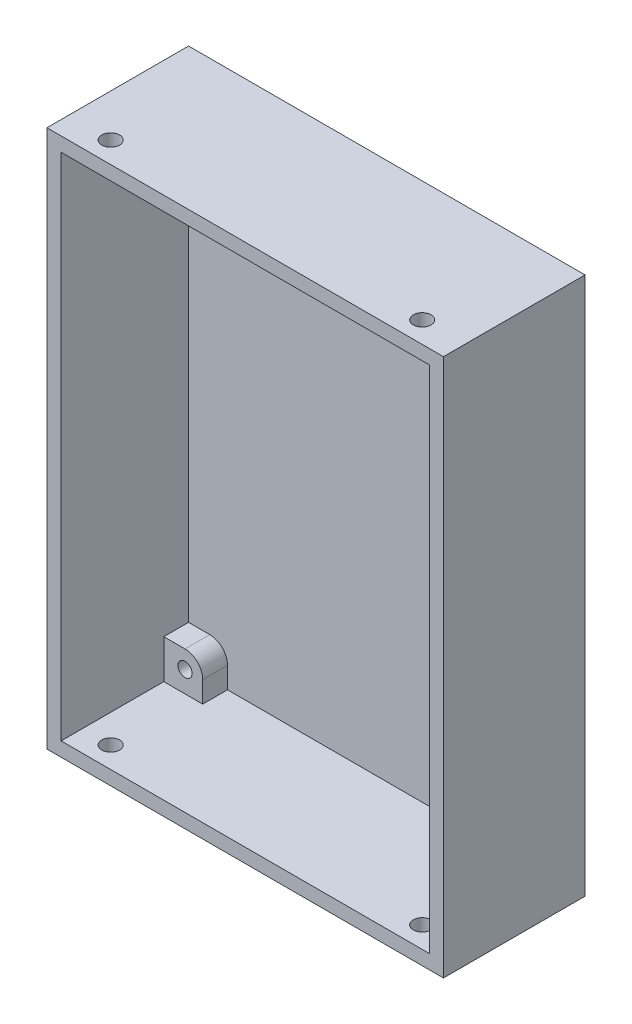
ISO-10303-21;
HEADER;
FILE_DESCRIPTION(('STEP AP214'),'2;1');
FILE_NAME('part.step','',(''),(''),'','','');
FILE_SCHEMA(('AUTOMOTIVE_DESIGN { 1 0 10303 214 1 1 1 1 }'));
ENDSEC;
DATA;
#1=APPLICATION_CONTEXT('core data for automotive mechanical design processes');
#2=APPLICATION_PROTOCOL_DEFINITION('international standard','automotive_design',2000,#1);
#3=PRODUCT_CONTEXT('',#1,'mechanical');
#4=PRODUCT('Part','Part','',(#3));
#5=PRODUCT_RELATED_PRODUCT_CATEGORY('part','',(#4));
#6=PRODUCT_DEFINITION_FORMATION('','',#4);
#7=PRODUCT_DEFINITION_CONTEXT('part definition',#1,'design');
#8=PRODUCT_DEFINITION('design','',#6,#7);
#9=PRODUCT_DEFINITION_SHAPE('','',#8);
#10=(LENGTH_UNIT() NAMED_UNIT(*) SI_UNIT(.MILLI.,.METRE.));
#11=(NAMED_UNIT(*) PLANE_ANGLE_UNIT() SI_UNIT($,.RADIAN.));
#12=(NAMED_UNIT(*) SI_UNIT($,.STERADIAN.) SOLID_ANGLE_UNIT());
#13=UNCERTAINTY_MEASURE_WITH_UNIT(LENGTH_MEASURE(1.E-05),#10,'distance_accuracy_value','');
#14=(GEOMETRIC_REPRESENTATION_CONTEXT(3) GLOBAL_UNCERTAINTY_ASSIGNED_CONTEXT((#13)) GLOBAL_UNIT_ASSIGNED_CONTEXT((#10,
#11,#12)) REPRESENTATION_CONTEXT('',''));
#15=CARTESIAN_POINT('',(0.,0.,0.));
#16=DIRECTION('',(0.,0.,1.));
#17=DIRECTION('',(1.,0.,0.));
#18=AXIS2_PLACEMENT_3D('',#15,#16,#17);
#19=CARTESIAN_POINT('',(0.,0.,0.));
#20=DIRECTION('',(0.,0.,1.));
#21=DIRECTION('',(1.,0.,0.));
#22=AXIS2_PLACEMENT_3D('',#19,#20,#21);
#23=PLANE('',#22);
#24=DIRECTION('',(0.,1.,0.));
#25=VECTOR('',#24,1.);
#26=CARTESIAN_POINT('',(-26.,0.,0.));
#27=LINE('',#26,#25);
#28=CARTESIAN_POINT('',(-26.,-30.5,0.));
#29=VERTEX_POINT('',#28);
#30=CARTESIAN_POINT('',(-26.,30.5,0.));
#31=VERTEX_POINT('',#30);
#32=EDGE_CURVE('E376',#29,#31,#27,.T.);
#33=ORIENTED_EDGE('',*,*,#32,.F.);
#34=DIRECTION('',(-1.,0.,0.));
#35=VECTOR('',#34,1.);
#36=CARTESIAN_POINT('',(0.,-30.5,0.));
#37=LINE('',#36,#35);
#38=CARTESIAN_POINT('',(-23.,-30.5,0.));
#39=VERTEX_POINT('',#38);
#40=EDGE_CURVE('E233',#39,#29,#37,.T.);
#41=ORIENTED_EDGE('',*,*,#40,.F.);
#42=CARTESIAN_POINT('',(-23.,-33.,0.));
#43=DIRECTION('',(0.,0.,-1.));
#44=DIRECTION('',(1.,0.,0.));
#45=AXIS2_PLACEMENT_3D('',#42,#43,#44);
#46=CIRCLE('',#45,2.5);
#47=CARTESIAN_POINT('',(-20.5,-33.,0.));
#48=VERTEX_POINT('',#47);
#49=EDGE_CURVE('E203',#39,#48,#46,.T.);
#50=ORIENTED_EDGE('',*,*,#49,.T.);
#51=DIRECTION('',(0.,-1.,0.));
#52=VECTOR('',#51,1.);
#53=CARTESIAN_POINT('',(-20.5,0.,0.));
#54=LINE('',#53,#52);
#55=CARTESIAN_POINT('',(-20.5,-36.,0.));
#56=VERTEX_POINT('',#55);
#57=EDGE_CURVE('E219',#48,#56,#54,.T.);
#58=ORIENTED_EDGE('',*,*,#57,.T.);
#59=DIRECTION('',(1.,0.,0.));
#60=VECTOR('',#59,1.);
#61=CARTESIAN_POINT('',(0.,-36.,0.));
#62=LINE('',#61,#60);
#63=CARTESIAN_POINT('',(20.5,-36.,0.));
#64=VERTEX_POINT('',#63);
#65=EDGE_CURVE('E350',#56,#64,#62,.T.);
#66=ORIENTED_EDGE('',*,*,#65,.T.);
#67=DIRECTION('',(0.,-1.,0.));
#68=VECTOR('',#67,1.);
#69=CARTESIAN_POINT('',(20.5,0.,0.));
#70=LINE('',#69,#68);
#71=CARTESIAN_POINT('',(20.5,-33.,0.));
#72=VERTEX_POINT('',#71);
#73=EDGE_CURVE('E58',#72,#64,#70,.T.);
#74=ORIENTED_EDGE('',*,*,#73,.F.);
#75=CARTESIAN_POINT('',(23.,-33.,0.));
#76=DIRECTION('',(0.,0.,1.));
#77=DIRECTION('',(-1.,0.,0.));
#78=AXIS2_PLACEMENT_3D('',#75,#76,#77);
#79=CIRCLE('',#78,2.5);
#80=CARTESIAN_POINT('',(23.,-30.5,0.));
#81=VERTEX_POINT('',#80);
#82=EDGE_CURVE('E205',#81,#72,#79,.T.);
#83=ORIENTED_EDGE('',*,*,#82,.F.);
#84=DIRECTION('',(1.,0.,0.));
#85=VECTOR('',#84,1.);
#86=CARTESIAN_POINT('',(0.,-30.5,0.));
#87=LINE('',#86,#85);
#88=CARTESIAN_POINT('',(26.,-30.5,0.));
#89=VERTEX_POINT('',#88);
#90=EDGE_CURVE('E245',#81,#89,#87,.T.);
#91=ORIENTED_EDGE('',*,*,#90,.T.);
#92=DIRECTION('',(0.,1.,0.));
#93=VECTOR('',#92,1.);
#94=CARTESIAN_POINT('',(26.,0.,0.));
#95=LINE('',#94,#93);
#96=CARTESIAN_POINT('',(26.,30.5,0.));
#97=VERTEX_POINT('',#96);
#98=EDGE_CURVE('E355',#89,#97,#95,.T.);
#99=ORIENTED_EDGE('',*,*,#98,.T.);
#100=DIRECTION('',(1.,0.,0.));
#101=VECTOR('',#100,1.);
#102=CARTESIAN_POINT('',(0.,30.5,0.));
#103=LINE('',#102,#101);
#104=CARTESIAN_POINT('',(23.,30.5,0.));
#105=VERTEX_POINT('',#104);
#106=EDGE_CURVE('E299',#105,#97,#103,.T.);
#107=ORIENTED_EDGE('',*,*,#106,.F.);
#108=CARTESIAN_POINT('',(23.,33.,0.));
#109=DIRECTION('',(0.,0.,-1.));
#110=DIRECTION('',(-1.,0.,0.));
#111=AXIS2_PLACEMENT_3D('',#108,#109,#110);
#112=CIRCLE('',#111,2.5);
#113=CARTESIAN_POINT('',(20.5,33.,0.));
#114=VERTEX_POINT('',#113);
#115=EDGE_CURVE('E297',#105,#114,#112,.T.);
#116=ORIENTED_EDGE('',*,*,#115,.T.);
#117=DIRECTION('',(0.,1.,0.));
#118=VECTOR('',#117,1.);
#119=CARTESIAN_POINT('',(20.5,0.,0.));
#120=LINE('',#119,#118);
#121=CARTESIAN_POINT('',(20.5,36.,0.));
#122=VERTEX_POINT('',#121);
#123=EDGE_CURVE('E279',#114,#122,#120,.T.);
#124=ORIENTED_EDGE('',*,*,#123,.T.);
#125=DIRECTION('',(1.,0.,0.));
#126=VECTOR('',#125,1.);
#127=CARTESIAN_POINT('',(0.,36.,0.));
#128=LINE('',#127,#126);
#129=CARTESIAN_POINT('',(-20.5,36.,0.));
#130=VERTEX_POINT('',#129);
#131=EDGE_CURVE('E378',#130,#122,#128,.T.);
#132=ORIENTED_EDGE('',*,*,#131,.F.);
#133=DIRECTION('',(0.,1.,0.));
#134=VECTOR('',#133,1.);
#135=CARTESIAN_POINT('',(-20.5,0.,0.));
#136=LINE('',#135,#134);
#137=CARTESIAN_POINT('',(-20.5,33.,0.));
#138=VERTEX_POINT('',#137);
#139=EDGE_CURVE('E335',#138,#130,#136,.T.);
#140=ORIENTED_EDGE('',*,*,#139,.F.);
#141=CARTESIAN_POINT('',(-23.,33.,0.));
#142=DIRECTION('',(0.,0.,1.));
#143=DIRECTION('',(1.,0.,0.));
#144=AXIS2_PLACEMENT_3D('',#141,#142,#143);
#145=CIRCLE('',#144,2.5);
#146=CARTESIAN_POINT('',(-23.,30.5,0.));
#147=VERTEX_POINT('',#146);
#148=EDGE_CURVE('E314',#147,#138,#145,.T.);
#149=ORIENTED_EDGE('',*,*,#148,.F.);
#150=DIRECTION('',(-1.,0.,0.));
#151=VECTOR('',#150,1.);
#152=CARTESIAN_POINT('',(0.,30.5,0.));
#153=LINE('',#152,#151);
#154=EDGE_CURVE('E319',#147,#31,#153,.T.);
#155=ORIENTED_EDGE('',*,*,#154,.T.);
#156=EDGE_LOOP('',(#33,#41,#50,#58,#66,#74,#83,#91,#99,#107,#116,#124,#132,#140,#149,#155));
#157=FACE_BOUND('',#156,.T.);
#158=ADVANCED_FACE('F35',(#157),#23,.T.);
#159=CARTESIAN_POINT('',(-26.,0.,18.));
#160=DIRECTION('',(-1.,0.,0.));
#161=DIRECTION('',(0.,0.,1.));
#162=AXIS2_PLACEMENT_3D('',#159,#160,#161);
#163=PLANE('',#162);
#164=DIRECTION('',(0.,0.,-1.));
#165=VECTOR('',#164,1.);
#166=CARTESIAN_POINT('',(-26.,-30.5,3.5));
#167=LINE('',#166,#165);
#168=CARTESIAN_POINT('',(-26.,-30.5,3.5));
#169=VERTEX_POINT('',#168);
#170=EDGE_CURVE('E50',#169,#29,#167,.T.);
#171=ORIENTED_EDGE('',*,*,#170,.T.);
#172=ORIENTED_EDGE('',*,*,#32,.T.);
#173=DIRECTION('',(0.,0.,-1.));
#174=VECTOR('',#173,1.);
#175=CARTESIAN_POINT('',(-26.,30.5,3.5));
#176=LINE('',#175,#174);
#177=CARTESIAN_POINT('',(-26.,30.5,3.5));
#178=VERTEX_POINT('',#177);
#179=EDGE_CURVE('E342',#178,#31,#176,.T.);
#180=ORIENTED_EDGE('',*,*,#179,.F.);
#181=DIRECTION('',(0.,1.,0.));
#182=VECTOR('',#181,1.);
#183=CARTESIAN_POINT('',(-26.,0.,3.5));
#184=LINE('',#183,#182);
#185=CARTESIAN_POINT('',(-26.,36.,3.5));
#186=VERTEX_POINT('',#185);
#187=EDGE_CURVE('E327',#178,#186,#184,.T.);
#188=ORIENTED_EDGE('',*,*,#187,.T.);
#189=DIRECTION('',(0.,0.,-1.));
#190=VECTOR('',#189,1.);
#191=CARTESIAN_POINT('',(-26.,36.,18.));
#192=LINE('',#191,#190);
#193=CARTESIAN_POINT('',(-26.,36.,18.));
#194=VERTEX_POINT('',#193);
#195=EDGE_CURVE('E385',#194,#186,#192,.T.);
#196=ORIENTED_EDGE('',*,*,#195,.F.);
#197=DIRECTION('',(0.,1.,0.));
#198=VECTOR('',#197,1.);
#199=CARTESIAN_POINT('',(-26.,0.,18.));
#200=LINE('',#199,#198);
#201=CARTESIAN_POINT('',(-26.,-36.,18.));
#202=VERTEX_POINT('',#201);
#203=EDGE_CURVE('E354',#202,#194,#200,.T.);
#204=ORIENTED_EDGE('',*,*,#203,.F.);
#205=DIRECTION('',(0.,0.,-1.));
#206=VECTOR('',#205,1.);
#207=CARTESIAN_POINT('',(-26.,-36.,18.));
#208=LINE('',#207,#206);
#209=CARTESIAN_POINT('',(-26.,-36.,3.5));
#210=VERTEX_POINT('',#209);
#211=EDGE_CURVE('E388',#202,#210,#208,.T.);
#212=ORIENTED_EDGE('',*,*,#211,.T.);
#213=DIRECTION('',(0.,-1.,0.));
#214=VECTOR('',#213,1.);
#215=CARTESIAN_POINT('',(-26.,0.,3.5));
#216=LINE('',#215,#214);
#217=EDGE_CURVE('E211',#169,#210,#216,.T.);
#218=ORIENTED_EDGE('',*,*,#217,.F.);
#219=EDGE_LOOP('',(#171,#172,#180,#188,#196,#204,#212,#218));
#220=FACE_BOUND('',#219,.T.);
#221=ADVANCED_FACE('F440',(#220),#163,.F.);
#222=CARTESIAN_POINT('',(0.,-36.,18.));
#223=DIRECTION('',(0.,1.,0.));
#224=DIRECTION('',(0.,0.,1.));
#225=AXIS2_PLACEMENT_3D('',#222,#223,#224);
#226=PLANE('',#225);
#227=CARTESIAN_POINT('',(22.,-36.,15.));
#228=DIRECTION('',(0.,1.,0.));
#229=DIRECTION('',(0.,0.,1.));
#230=AXIS2_PLACEMENT_3D('',#227,#228,#229);
#231=CIRCLE('',#230,1.25);
#232=CARTESIAN_POINT('',(22.,-36.,16.25));
#233=VERTEX_POINT('',#232);
#234=EDGE_CURVE('E550',#233,#233,#231,.T.);
#235=ORIENTED_EDGE('',*,*,#234,.F.);
#236=EDGE_LOOP('',(#235));
#237=FACE_BOUND('',#236,.T.);
#238=CARTESIAN_POINT('',(-22.,-36.,15.));
#239=DIRECTION('',(0.,1.,0.));
#240=DIRECTION('',(0.,0.,1.));
#241=AXIS2_PLACEMENT_3D('',#238,#239,#240);
#242=CIRCLE('',#241,1.25);
#243=CARTESIAN_POINT('',(-22.,-36.,16.25));
#244=VERTEX_POINT('',#243);
#245=EDGE_CURVE('E231',#244,#244,#242,.T.);
#246=ORIENTED_EDGE('',*,*,#245,.F.);
#247=EDGE_LOOP('',(#246));
#248=FACE_BOUND('',#247,.T.);
#249=DIRECTION('',(0.,0.,-1.));
#250=VECTOR('',#249,1.);
#251=CARTESIAN_POINT('',(-20.5,-36.,3.5));
#252=LINE('',#251,#250);
#253=CARTESIAN_POINT('',(-20.5,-36.,3.5));
#254=VERTEX_POINT('',#253);
#255=EDGE_CURVE('E238',#254,#56,#252,.T.);
#256=ORIENTED_EDGE('',*,*,#255,.F.);
#257=DIRECTION('',(1.,0.,0.));
#258=VECTOR('',#257,1.);
#259=CARTESIAN_POINT('',(0.,-36.,3.5));
#260=LINE('',#259,#258);
#261=EDGE_CURVE('E224',#210,#254,#260,.T.);
#262=ORIENTED_EDGE('',*,*,#261,.F.);
#263=ORIENTED_EDGE('',*,*,#211,.F.);
#264=DIRECTION('',(1.,0.,0.));
#265=VECTOR('',#264,1.);
#266=CARTESIAN_POINT('',(0.,-36.,18.));
#267=LINE('',#266,#265);
#268=CARTESIAN_POINT('',(26.,-36.,18.));
#269=VERTEX_POINT('',#268);
#270=EDGE_CURVE('E351',#202,#269,#267,.T.);
#271=ORIENTED_EDGE('',*,*,#270,.T.);
#272=DIRECTION('',(0.,0.,-1.));
#273=VECTOR('',#272,1.);
#274=CARTESIAN_POINT('',(26.,-36.,18.));
#275=LINE('',#274,#273);
#276=CARTESIAN_POINT('',(26.,-36.,3.5));
#277=VERTEX_POINT('',#276);
#278=EDGE_CURVE('E374',#269,#277,#275,.T.);
#279=ORIENTED_EDGE('',*,*,#278,.T.);
#280=DIRECTION('',(-1.,0.,0.));
#281=VECTOR('',#280,1.);
#282=CARTESIAN_POINT('',(0.,-36.,3.5));
#283=LINE('',#282,#281);
#284=CARTESIAN_POINT('',(20.5,-36.,3.5));
#285=VERTEX_POINT('',#284);
#286=EDGE_CURVE('E251',#277,#285,#283,.T.);
#287=ORIENTED_EDGE('',*,*,#286,.T.);
#288=DIRECTION('',(0.,0.,-1.));
#289=VECTOR('',#288,1.);
#290=CARTESIAN_POINT('',(20.5,-36.,3.5));
#291=LINE('',#290,#289);
#292=EDGE_CURVE('E269',#285,#64,#291,.T.);
#293=ORIENTED_EDGE('',*,*,#292,.T.);
#294=ORIENTED_EDGE('',*,*,#65,.F.);
#295=EDGE_LOOP('',(#256,#262,#263,#271,#279,#287,#293,#294));
#296=FACE_BOUND('',#295,.T.);
#297=ADVANCED_FACE('F444',(#237,#248,#296),#226,.T.);
#298=CARTESIAN_POINT('',(26.,0.,18.));
#299=DIRECTION('',(-1.,0.,0.));
#300=DIRECTION('',(0.,0.,1.));
#301=AXIS2_PLACEMENT_3D('',#298,#299,#300);
#302=PLANE('',#301);
#303=DIRECTION('',(0.,0.,-1.));
#304=VECTOR('',#303,1.);
#305=CARTESIAN_POINT('',(26.,-30.5,3.5));
#306=LINE('',#305,#304);
#307=CARTESIAN_POINT('',(26.,-30.5,3.5));
#308=VERTEX_POINT('',#307);
#309=EDGE_CURVE('E266',#308,#89,#306,.T.);
#310=ORIENTED_EDGE('',*,*,#309,.F.);
#311=DIRECTION('',(0.,-1.,0.));
#312=VECTOR('',#311,1.);
#313=CARTESIAN_POINT('',(26.,0.,3.5));
#314=LINE('',#313,#312);
#315=EDGE_CURVE('E253',#308,#277,#314,.T.);
#316=ORIENTED_EDGE('',*,*,#315,.T.);
#317=ORIENTED_EDGE('',*,*,#278,.F.);
#318=DIRECTION('',(0.,1.,0.));
#319=VECTOR('',#318,1.);
#320=CARTESIAN_POINT('',(26.,0.,18.));
#321=LINE('',#320,#319);
#322=CARTESIAN_POINT('',(26.,36.,18.));
#323=VERTEX_POINT('',#322);
#324=EDGE_CURVE('E359',#269,#323,#321,.T.);
#325=ORIENTED_EDGE('',*,*,#324,.T.);
#326=DIRECTION('',(0.,0.,-1.));
#327=VECTOR('',#326,1.);
#328=CARTESIAN_POINT('',(26.,36.,18.));
#329=LINE('',#328,#327);
#330=CARTESIAN_POINT('',(26.,36.,3.5));
#331=VERTEX_POINT('',#330);
#332=EDGE_CURVE('E383',#323,#331,#329,.T.);
#333=ORIENTED_EDGE('',*,*,#332,.T.);
#334=DIRECTION('',(0.,1.,0.));
#335=VECTOR('',#334,1.);
#336=CARTESIAN_POINT('',(26.,0.,3.5));
#337=LINE('',#336,#335);
#338=CARTESIAN_POINT('',(26.,30.5,3.5));
#339=VERTEX_POINT('',#338);
#340=EDGE_CURVE('E285',#339,#331,#337,.T.);
#341=ORIENTED_EDGE('',*,*,#340,.F.);
#342=DIRECTION('',(0.,0.,-1.));
#343=VECTOR('',#342,1.);
#344=CARTESIAN_POINT('',(26.,30.5,3.5));
#345=LINE('',#344,#343);
#346=EDGE_CURVE('E308',#339,#97,#345,.T.);
#347=ORIENTED_EDGE('',*,*,#346,.T.);
#348=ORIENTED_EDGE('',*,*,#98,.F.);
#349=EDGE_LOOP('',(#310,#316,#317,#325,#333,#341,#347,#348));
#350=FACE_BOUND('',#349,.T.);
#351=ADVANCED_FACE('F497',(#350),#302,.T.);
#352=CARTESIAN_POINT('',(0.,36.,18.));
#353=DIRECTION('',(0.,1.,0.));
#354=DIRECTION('',(0.,0.,1.));
#355=AXIS2_PLACEMENT_3D('',#352,#353,#354);
#356=PLANE('',#355);
#357=CARTESIAN_POINT('',(22.,36.,15.));
#358=DIRECTION('',(0.,1.,0.));
#359=DIRECTION('',(0.,0.,1.));
#360=AXIS2_PLACEMENT_3D('',#357,#358,#359);
#361=CIRCLE('',#360,1.25);
#362=CARTESIAN_POINT('',(22.,36.,16.25));
#363=VERTEX_POINT('',#362);
#364=EDGE_CURVE('E757',#363,#363,#361,.T.);
#365=ORIENTED_EDGE('',*,*,#364,.T.);
#366=EDGE_LOOP('',(#365));
#367=FACE_BOUND('',#366,.T.);
#368=CARTESIAN_POINT('',(-22.,36.,15.));
#369=DIRECTION('',(0.,1.,0.));
#370=DIRECTION('',(0.,0.,1.));
#371=AXIS2_PLACEMENT_3D('',#368,#369,#370);
#372=CIRCLE('',#371,1.25);
#373=CARTESIAN_POINT('',(-22.,36.,16.25));
#374=VERTEX_POINT('',#373);
#375=EDGE_CURVE('E544',#374,#374,#372,.T.);
#376=ORIENTED_EDGE('',*,*,#375,.T.);
#377=EDGE_LOOP('',(#376));
#378=FACE_BOUND('',#377,.T.);
#379=ORIENTED_EDGE('',*,*,#131,.T.);
#380=DIRECTION('',(0.,0.,-1.));
#381=VECTOR('',#380,1.);
#382=CARTESIAN_POINT('',(20.5,36.,3.5));
#383=LINE('',#382,#381);
#384=CARTESIAN_POINT('',(20.5,36.,3.5));
#385=VERTEX_POINT('',#384);
#386=EDGE_CURVE('E305',#385,#122,#383,.T.);
#387=ORIENTED_EDGE('',*,*,#386,.F.);
#388=DIRECTION('',(-1.,0.,0.));
#389=VECTOR('',#388,1.);
#390=CARTESIAN_POINT('',(0.,36.,3.5));
#391=LINE('',#390,#389);
#392=EDGE_CURVE('E288',#331,#385,#391,.T.);
#393=ORIENTED_EDGE('',*,*,#392,.F.);
#394=ORIENTED_EDGE('',*,*,#332,.F.);
#395=DIRECTION('',(1.,0.,0.));
#396=VECTOR('',#395,1.);
#397=CARTESIAN_POINT('',(0.,36.,18.));
#398=LINE('',#397,#396);
#399=EDGE_CURVE('E357',#194,#323,#398,.T.);
#400=ORIENTED_EDGE('',*,*,#399,.F.);
#401=ORIENTED_EDGE('',*,*,#195,.T.);
#402=DIRECTION('',(1.,0.,0.));
#403=VECTOR('',#402,1.);
#404=CARTESIAN_POINT('',(0.,36.,3.5));
#405=LINE('',#404,#403);
#406=CARTESIAN_POINT('',(-20.5,36.,3.5));
#407=VERTEX_POINT('',#406);
#408=EDGE_CURVE('E325',#186,#407,#405,.T.);
#409=ORIENTED_EDGE('',*,*,#408,.T.);
#410=DIRECTION('',(0.,0.,-1.));
#411=VECTOR('',#410,1.);
#412=CARTESIAN_POINT('',(-20.5,36.,3.5));
#413=LINE('',#412,#411);
#414=EDGE_CURVE('E345',#407,#130,#413,.T.);
#415=ORIENTED_EDGE('',*,*,#414,.T.);
#416=EDGE_LOOP('',(#379,#387,#393,#394,#400,#401,#409,#415));
#417=FACE_BOUND('',#416,.T.);
#418=ADVANCED_FACE('F500',(#367,#378,#417),#356,.F.);
#419=CARTESIAN_POINT('',(-28.,-38.,-2.));
#420=DIRECTION('',(0.,-1.,0.));
#421=DIRECTION('',(0.,0.,-1.));
#422=AXIS2_PLACEMENT_3D('',#419,#420,#421);
#423=PLANE('',#422);
#424=CARTESIAN_POINT('',(22.,-38.,15.));
#425=DIRECTION('',(0.,-1.,0.));
#426=DIRECTION('',(0.,0.,1.));
#427=AXIS2_PLACEMENT_3D('',#424,#425,#426);
#428=CIRCLE('',#427,1.25);
#429=CARTESIAN_POINT('',(22.,-38.,16.25));
#430=VERTEX_POINT('',#429);
#431=EDGE_CURVE('E755',#430,#430,#428,.T.);
#432=ORIENTED_EDGE('',*,*,#431,.F.);
#433=EDGE_LOOP('',(#432));
#434=FACE_BOUND('',#433,.T.);
#435=CARTESIAN_POINT('',(-22.,-38.,15.));
#436=DIRECTION('',(0.,-1.,0.));
#437=DIRECTION('',(0.,0.,-1.));
#438=AXIS2_PLACEMENT_3D('',#435,#436,#437);
#439=CIRCLE('',#438,1.25);
#440=CARTESIAN_POINT('',(-22.,-38.,13.75));
#441=VERTEX_POINT('',#440);
#442=EDGE_CURVE('E545',#441,#441,#439,.T.);
#443=ORIENTED_EDGE('',*,*,#442,.F.);
#444=EDGE_LOOP('',(#443));
#445=FACE_BOUND('',#444,.T.);
#446=DIRECTION('',(0.,0.,1.));
#447=VECTOR('',#446,1.);
#448=CARTESIAN_POINT('',(28.,-38.,-2.));
#449=LINE('',#448,#447);
#450=CARTESIAN_POINT('',(28.,-38.,-2.));
#451=VERTEX_POINT('',#450);
#452=CARTESIAN_POINT('',(28.,-38.,18.));
#453=VERTEX_POINT('',#452);
#454=EDGE_CURVE('E401',#451,#453,#449,.T.);
#455=ORIENTED_EDGE('',*,*,#454,.T.);
#456=DIRECTION('',(1.,0.,0.));
#457=VECTOR('',#456,1.);
#458=CARTESIAN_POINT('',(0.,-38.,18.));
#459=LINE('',#458,#457);
#460=CARTESIAN_POINT('',(-28.,-38.,18.));
#461=VERTEX_POINT('',#460);
#462=EDGE_CURVE('E365',#461,#453,#459,.T.);
#463=ORIENTED_EDGE('',*,*,#462,.F.);
#464=DIRECTION('',(0.,0.,1.));
#465=VECTOR('',#464,1.);
#466=CARTESIAN_POINT('',(-28.,-38.,-2.));
#467=LINE('',#466,#465);
#468=CARTESIAN_POINT('',(-28.,-38.,-2.));
#469=VERTEX_POINT('',#468);
#470=EDGE_CURVE('E402',#469,#461,#467,.T.);
#471=ORIENTED_EDGE('',*,*,#470,.F.);
#472=DIRECTION('',(1.,0.,0.));
#473=VECTOR('',#472,1.);
#474=CARTESIAN_POINT('',(-28.,-38.,-2.));
#475=LINE('',#474,#473);
#476=EDGE_CURVE('E391',#469,#451,#475,.T.);
#477=ORIENTED_EDGE('',*,*,#476,.T.);
#478=EDGE_LOOP('',(#455,#463,#471,#477));
#479=FACE_BOUND('',#478,.T.);
#480=ADVANCED_FACE('F37',(#434,#445,#479),#423,.T.);
#481=CARTESIAN_POINT('',(-28.,-38.,-2.));
#482=DIRECTION('',(1.,0.,0.));
#483=DIRECTION('',(0.,0.,-1.));
#484=AXIS2_PLACEMENT_3D('',#481,#482,#483);
#485=PLANE('',#484);
#486=ORIENTED_EDGE('',*,*,#470,.T.);
#487=DIRECTION('',(0.,1.,0.));
#488=VECTOR('',#487,1.);
#489=CARTESIAN_POINT('',(-28.,0.,18.));
#490=LINE('',#489,#488);
#491=CARTESIAN_POINT('',(-28.,38.,18.));
#492=VERTEX_POINT('',#491);
#493=EDGE_CURVE('E362',#461,#492,#490,.T.);
#494=ORIENTED_EDGE('',*,*,#493,.T.);
#495=DIRECTION('',(0.,0.,1.));
#496=VECTOR('',#495,1.);
#497=CARTESIAN_POINT('',(-28.,38.,-2.));
#498=LINE('',#497,#496);
#499=CARTESIAN_POINT('',(-28.,38.,-2.));
#500=VERTEX_POINT('',#499);
#501=EDGE_CURVE('E404',#500,#492,#498,.T.);
#502=ORIENTED_EDGE('',*,*,#501,.F.);
#503=DIRECTION('',(0.,1.,0.));
#504=VECTOR('',#503,1.);
#505=CARTESIAN_POINT('',(-28.,-38.,-2.));
#506=LINE('',#505,#504);
#507=EDGE_CURVE('E399',#469,#500,#506,.T.);
#508=ORIENTED_EDGE('',*,*,#507,.F.);
#509=EDGE_LOOP('',(#486,#494,#502,#508));
#510=FACE_BOUND('',#509,.T.);
#511=ADVANCED_FACE('F524',(#510),#485,.F.);
#512=CARTESIAN_POINT('',(-28.,38.,-2.));
#513=DIRECTION('',(0.,-1.,0.));
#514=DIRECTION('',(0.,0.,-1.));
#515=AXIS2_PLACEMENT_3D('',#512,#513,#514);
#516=PLANE('',#515);
#517=CARTESIAN_POINT('',(22.,38.,15.));
#518=DIRECTION('',(0.,-1.,0.));
#519=DIRECTION('',(0.,0.,1.));
#520=AXIS2_PLACEMENT_3D('',#517,#518,#519);
#521=CIRCLE('',#520,1.25);
#522=CARTESIAN_POINT('',(22.,38.,16.25));
#523=VERTEX_POINT('',#522);
#524=EDGE_CURVE('E539',#523,#523,#521,.T.);
#525=ORIENTED_EDGE('',*,*,#524,.T.);
#526=EDGE_LOOP('',(#525));
#527=FACE_BOUND('',#526,.T.);
#528=CARTESIAN_POINT('',(-22.,38.,15.));
#529=DIRECTION('',(0.,-1.,0.));
#530=DIRECTION('',(0.,0.,-1.));
#531=AXIS2_PLACEMENT_3D('',#528,#529,#530);
#532=CIRCLE('',#531,1.25);
#533=CARTESIAN_POINT('',(-22.,38.,13.75));
#534=VERTEX_POINT('',#533);
#535=EDGE_CURVE('E542',#534,#534,#532,.T.);
#536=ORIENTED_EDGE('',*,*,#535,.T.);
#537=EDGE_LOOP('',(#536));
#538=FACE_BOUND('',#537,.T.);
#539=ORIENTED_EDGE('',*,*,#501,.T.);
#540=DIRECTION('',(1.,0.,0.));
#541=VECTOR('',#540,1.);
#542=CARTESIAN_POINT('',(0.,38.,18.));
#543=LINE('',#542,#541);
#544=CARTESIAN_POINT('',(28.,38.,18.));
#545=VERTEX_POINT('',#544);
#546=EDGE_CURVE('E371',#492,#545,#543,.T.);
#547=ORIENTED_EDGE('',*,*,#546,.T.);
#548=DIRECTION('',(0.,0.,1.));
#549=VECTOR('',#548,1.);
#550=CARTESIAN_POINT('',(28.,38.,-2.));
#551=LINE('',#550,#549);
#552=CARTESIAN_POINT('',(28.,38.,-2.));
#553=VERTEX_POINT('',#552);
#554=EDGE_CURVE('E406',#553,#545,#551,.T.);
#555=ORIENTED_EDGE('',*,*,#554,.F.);
#556=DIRECTION('',(1.,0.,0.));
#557=VECTOR('',#556,1.);
#558=CARTESIAN_POINT('',(-28.,38.,-2.));
#559=LINE('',#558,#557);
#560=EDGE_CURVE('E397',#500,#553,#559,.T.);
#561=ORIENTED_EDGE('',*,*,#560,.F.);
#562=EDGE_LOOP('',(#539,#547,#555,#561));
#563=FACE_BOUND('',#562,.T.);
#564=ADVANCED_FACE('F513',(#527,#538,#563),#516,.F.);
#565=CARTESIAN_POINT('',(28.,-38.,-2.));
#566=DIRECTION('',(1.,0.,0.));
#567=DIRECTION('',(0.,0.,-1.));
#568=AXIS2_PLACEMENT_3D('',#565,#566,#567);
#569=PLANE('',#568);
#570=ORIENTED_EDGE('',*,*,#554,.T.);
#571=DIRECTION('',(0.,1.,0.));
#572=VECTOR('',#571,1.);
#573=CARTESIAN_POINT('',(28.,0.,18.));
#574=LINE('',#573,#572);
#575=EDGE_CURVE('E368',#453,#545,#574,.T.);
#576=ORIENTED_EDGE('',*,*,#575,.F.);
#577=ORIENTED_EDGE('',*,*,#454,.F.);
#578=DIRECTION('',(0.,1.,0.));
#579=VECTOR('',#578,1.);
#580=CARTESIAN_POINT('',(28.,-38.,-2.));
#581=LINE('',#580,#579);
#582=EDGE_CURVE('E394',#451,#553,#581,.T.);
#583=ORIENTED_EDGE('',*,*,#582,.T.);
#584=EDGE_LOOP('',(#570,#576,#577,#583));
#585=FACE_BOUND('',#584,.T.);
#586=ADVANCED_FACE('F508',(#585),#569,.T.);
#587=CARTESIAN_POINT('',(0.,0.,-2.));
#588=DIRECTION('',(0.,0.,1.));
#589=DIRECTION('',(1.,0.,0.));
#590=AXIS2_PLACEMENT_3D('',#587,#588,#589);
#591=PLANE('',#590);
#592=ORIENTED_EDGE('',*,*,#476,.F.);
#593=ORIENTED_EDGE('',*,*,#507,.T.);
#594=ORIENTED_EDGE('',*,*,#560,.T.);
#595=ORIENTED_EDGE('',*,*,#582,.F.);
#596=EDGE_LOOP('',(#592,#593,#594,#595));
#597=FACE_BOUND('',#596,.T.);
#598=ADVANCED_FACE('F495',(#597),#591,.F.);
#599=CARTESIAN_POINT('',(0.,0.,18.));
#600=DIRECTION('',(0.,0.,1.));
#601=DIRECTION('',(1.,0.,0.));
#602=AXIS2_PLACEMENT_3D('',#599,#600,#601);
#603=PLANE('',#602);
#604=ORIENTED_EDGE('',*,*,#270,.F.);
#605=ORIENTED_EDGE('',*,*,#203,.T.);
#606=ORIENTED_EDGE('',*,*,#399,.T.);
#607=ORIENTED_EDGE('',*,*,#324,.F.);
#608=EDGE_LOOP('',(#604,#605,#606,#607));
#609=FACE_BOUND('',#608,.T.);
#610=ORIENTED_EDGE('',*,*,#493,.F.);
#611=ORIENTED_EDGE('',*,*,#462,.T.);
#612=ORIENTED_EDGE('',*,*,#575,.T.);
#613=ORIENTED_EDGE('',*,*,#546,.F.);
#614=EDGE_LOOP('',(#610,#611,#612,#613));
#615=FACE_BOUND('',#614,.T.);
#616=ADVANCED_FACE('F488',(#609,#615),#603,.T.);
#617=CARTESIAN_POINT('',(-23.,33.,3.5));
#618=DIRECTION('',(0.,0.,-1.));
#619=DIRECTION('',(-1.,0.,0.));
#620=AXIS2_PLACEMENT_3D('',#617,#618,#619);
#621=CYLINDRICAL_SURFACE('',#620,2.5);
#622=ORIENTED_EDGE('',*,*,#148,.T.);
#623=DIRECTION('',(0.,0.,-1.));
#624=VECTOR('',#623,1.);
#625=CARTESIAN_POINT('',(-20.5,33.,3.5));
#626=LINE('',#625,#624);
#627=CARTESIAN_POINT('',(-20.5,33.,3.5));
#628=VERTEX_POINT('',#627);
#629=EDGE_CURVE('E347',#628,#138,#626,.T.);
#630=ORIENTED_EDGE('',*,*,#629,.F.);
#631=CARTESIAN_POINT('',(-23.,33.,3.5));
#632=DIRECTION('',(0.,0.,1.));
#633=DIRECTION('',(1.,0.,0.));
#634=AXIS2_PLACEMENT_3D('',#631,#632,#633);
#635=CIRCLE('',#634,2.5);
#636=CARTESIAN_POINT('',(-23.,30.5,3.5));
#637=VERTEX_POINT('',#636);
#638=EDGE_CURVE('E318',#637,#628,#635,.T.);
#639=ORIENTED_EDGE('',*,*,#638,.F.);
#640=DIRECTION('',(0.,0.,-1.));
#641=VECTOR('',#640,1.);
#642=CARTESIAN_POINT('',(-23.,30.5,3.5));
#643=LINE('',#642,#641);
#644=EDGE_CURVE('E332',#637,#147,#643,.T.);
#645=ORIENTED_EDGE('',*,*,#644,.T.);
#646=EDGE_LOOP('',(#622,#630,#639,#645));
#647=FACE_BOUND('',#646,.T.);
#648=ADVANCED_FACE('F484',(#647),#621,.T.);
#649=CARTESIAN_POINT('',(-20.5,0.,3.5));
#650=DIRECTION('',(-1.,0.,0.));
#651=DIRECTION('',(0.,0.,1.));
#652=AXIS2_PLACEMENT_3D('',#649,#650,#651);
#653=PLANE('',#652);
#654=ORIENTED_EDGE('',*,*,#139,.T.);
#655=ORIENTED_EDGE('',*,*,#414,.F.);
#656=DIRECTION('',(0.,1.,0.));
#657=VECTOR('',#656,1.);
#658=CARTESIAN_POINT('',(-20.5,0.,3.5));
#659=LINE('',#658,#657);
#660=EDGE_CURVE('E322',#628,#407,#659,.T.);
#661=ORIENTED_EDGE('',*,*,#660,.F.);
#662=ORIENTED_EDGE('',*,*,#629,.T.);
#663=EDGE_LOOP('',(#654,#655,#661,#662));
#664=FACE_BOUND('',#663,.T.);
#665=ADVANCED_FACE('F481',(#664),#653,.F.);
#666=CARTESIAN_POINT('',(-23.,33.,3.5));
#667=DIRECTION('',(0.,0.,-1.));
#668=DIRECTION('',(-1.,0.,0.));
#669=AXIS2_PLACEMENT_3D('',#666,#667,#668);
#670=CYLINDRICAL_SURFACE('',#669,1.);
#671=CARTESIAN_POINT('',(-23.,33.,3.5));
#672=DIRECTION('',(0.,0.,1.));
#673=DIRECTION('',(1.,0.,0.));
#674=AXIS2_PLACEMENT_3D('',#671,#672,#673);
#675=CIRCLE('',#674,1.);
#676=CARTESIAN_POINT('',(-22.,33.,3.5));
#677=VERTEX_POINT('',#676);
#678=EDGE_CURVE('E315',#677,#677,#675,.T.);
#679=ORIENTED_EDGE('',*,*,#678,.T.);
#680=EDGE_LOOP('',(#679));
#681=FACE_BOUND('',#680,.T.);
#682=CARTESIAN_POINT('',(-23.,33.,0.));
#683=DIRECTION('',(0.,0.,1.));
#684=DIRECTION('',(1.,0.,0.));
#685=AXIS2_PLACEMENT_3D('',#682,#683,#684);
#686=CIRCLE('',#685,1.);
#687=CARTESIAN_POINT('',(-22.,33.,0.));
#688=VERTEX_POINT('',#687);
#689=EDGE_CURVE('E43',#688,#688,#686,.F.);
#690=ORIENTED_EDGE('',*,*,#689,.T.);
#691=EDGE_LOOP('',(#690));
#692=FACE_BOUND('',#691,.T.);
#693=ADVANCED_FACE('F411',(#681,#692),#670,.F.);
#694=CARTESIAN_POINT('',(0.,30.5,3.5));
#695=DIRECTION('',(0.,-1.,0.));
#696=DIRECTION('',(1.,0.,0.));
#697=AXIS2_PLACEMENT_3D('',#694,#695,#696);
#698=PLANE('',#697);
#699=ORIENTED_EDGE('',*,*,#154,.F.);
#700=ORIENTED_EDGE('',*,*,#644,.F.);
#701=DIRECTION('',(-1.,0.,0.));
#702=VECTOR('',#701,1.);
#703=CARTESIAN_POINT('',(0.,30.5,3.5));
#704=LINE('',#703,#702);
#705=EDGE_CURVE('E329',#637,#178,#704,.T.);
#706=ORIENTED_EDGE('',*,*,#705,.T.);
#707=ORIENTED_EDGE('',*,*,#179,.T.);
#708=EDGE_LOOP('',(#699,#700,#706,#707));
#709=FACE_BOUND('',#708,.T.);
#710=ADVANCED_FACE('F427',(#709),#698,.T.);
#711=CARTESIAN_POINT('',(0.,0.,3.5));
#712=DIRECTION('',(0.,0.,1.));
#713=DIRECTION('',(1.,0.,0.));
#714=AXIS2_PLACEMENT_3D('',#711,#712,#713);
#715=PLANE('',#714);
#716=ORIENTED_EDGE('',*,*,#678,.F.);
#717=EDGE_LOOP('',(#716));
#718=FACE_BOUND('',#717,.T.);
#719=ORIENTED_EDGE('',*,*,#638,.T.);
#720=ORIENTED_EDGE('',*,*,#660,.T.);
#721=ORIENTED_EDGE('',*,*,#408,.F.);
#722=ORIENTED_EDGE('',*,*,#187,.F.);
#723=ORIENTED_EDGE('',*,*,#705,.F.);
#724=EDGE_LOOP('',(#719,#720,#721,#722,#723));
#725=FACE_BOUND('',#724,.T.);
#726=ADVANCED_FACE('F416',(#718,#725),#715,.T.);
#727=ORIENTED_EDGE('',*,*,#689,.F.);
#728=EDGE_LOOP('',(#727));
#729=FACE_BOUND('',#728,.T.);
#730=ADVANCED_FACE('F413',(#729),#23,.T.);
#731=CARTESIAN_POINT('',(23.,33.,3.5));
#732=DIRECTION('',(0.,0.,-1.));
#733=DIRECTION('',(-1.,0.,0.));
#734=AXIS2_PLACEMENT_3D('',#731,#732,#733);
#735=CYLINDRICAL_SURFACE('',#734,2.5);
#736=ORIENTED_EDGE('',*,*,#115,.F.);
#737=DIRECTION('',(0.,0.,-1.));
#738=VECTOR('',#737,1.);
#739=CARTESIAN_POINT('',(23.,30.5,3.5));
#740=LINE('',#739,#738);
#741=CARTESIAN_POINT('',(23.,30.5,3.5));
#742=VERTEX_POINT('',#741);
#743=EDGE_CURVE('E311',#742,#105,#740,.T.);
#744=ORIENTED_EDGE('',*,*,#743,.F.);
#745=CARTESIAN_POINT('',(23.,33.,3.5));
#746=DIRECTION('',(0.,0.,-1.));
#747=DIRECTION('',(-1.,0.,0.));
#748=AXIS2_PLACEMENT_3D('',#745,#746,#747);
#749=CIRCLE('',#748,2.5);
#750=CARTESIAN_POINT('',(20.5,33.,3.5));
#751=VERTEX_POINT('',#750);
#752=EDGE_CURVE('E278',#742,#751,#749,.T.);
#753=ORIENTED_EDGE('',*,*,#752,.T.);
#754=DIRECTION('',(0.,0.,-1.));
#755=VECTOR('',#754,1.);
#756=CARTESIAN_POINT('',(20.5,33.,3.5));
#757=LINE('',#756,#755);
#758=EDGE_CURVE('E294',#751,#114,#757,.T.);
#759=ORIENTED_EDGE('',*,*,#758,.T.);
#760=EDGE_LOOP('',(#736,#744,#753,#759));
#761=FACE_BOUND('',#760,.T.);
#762=ADVANCED_FACE('F415',(#761),#735,.T.);
#763=CARTESIAN_POINT('',(0.,30.5,3.5));
#764=DIRECTION('',(0.,1.,0.));
#765=DIRECTION('',(-1.,0.,0.));
#766=AXIS2_PLACEMENT_3D('',#763,#764,#765);
#767=PLANE('',#766);
#768=ORIENTED_EDGE('',*,*,#106,.T.);
#769=ORIENTED_EDGE('',*,*,#346,.F.);
#770=DIRECTION('',(1.,0.,0.));
#771=VECTOR('',#770,1.);
#772=CARTESIAN_POINT('',(0.,30.5,3.5));
#773=LINE('',#772,#771);
#774=EDGE_CURVE('E282',#742,#339,#773,.T.);
#775=ORIENTED_EDGE('',*,*,#774,.F.);
#776=ORIENTED_EDGE('',*,*,#743,.T.);
#777=EDGE_LOOP('',(#768,#769,#775,#776));
#778=FACE_BOUND('',#777,.T.);
#779=ADVANCED_FACE('F424',(#778),#767,.F.);
#780=CARTESIAN_POINT('',(23.,33.,3.5));
#781=DIRECTION('',(0.,0.,-1.));
#782=DIRECTION('',(-1.,0.,0.));
#783=AXIS2_PLACEMENT_3D('',#780,#781,#782);
#784=CYLINDRICAL_SURFACE('',#783,1.);
#785=CARTESIAN_POINT('',(23.,33.,3.5));
#786=DIRECTION('',(0.,0.,-1.));
#787=DIRECTION('',(-1.,0.,0.));
#788=AXIS2_PLACEMENT_3D('',#785,#786,#787);
#789=CIRCLE('',#788,1.);
#790=CARTESIAN_POINT('',(22.,33.,3.5));
#791=VERTEX_POINT('',#790);
#792=EDGE_CURVE('E275',#791,#791,#789,.T.);
#793=ORIENTED_EDGE('',*,*,#792,.F.);
#794=EDGE_LOOP('',(#793));
#795=FACE_BOUND('',#794,.T.);
#796=CARTESIAN_POINT('',(23.,33.,0.));
#797=DIRECTION('',(0.,0.,-1.));
#798=DIRECTION('',(-1.,0.,0.));
#799=AXIS2_PLACEMENT_3D('',#796,#797,#798);
#800=CIRCLE('',#799,1.);
#801=CARTESIAN_POINT('',(22.,33.,0.));
#802=VERTEX_POINT('',#801);
#803=EDGE_CURVE('E274',#802,#802,#800,.T.);
#804=ORIENTED_EDGE('',*,*,#803,.T.);
#805=EDGE_LOOP('',(#804));
#806=FACE_BOUND('',#805,.T.);
#807=ADVANCED_FACE('F464',(#795,#806),#784,.F.);
#808=CARTESIAN_POINT('',(20.5,0.,3.5));
#809=DIRECTION('',(-1.,0.,0.));
#810=DIRECTION('',(0.,0.,1.));
#811=AXIS2_PLACEMENT_3D('',#808,#809,#810);
#812=PLANE('',#811);
#813=ORIENTED_EDGE('',*,*,#123,.F.);
#814=ORIENTED_EDGE('',*,*,#758,.F.);
#815=DIRECTION('',(0.,1.,0.));
#816=VECTOR('',#815,1.);
#817=CARTESIAN_POINT('',(20.5,0.,3.5));
#818=LINE('',#817,#816);
#819=EDGE_CURVE('E291',#751,#385,#818,.T.);
#820=ORIENTED_EDGE('',*,*,#819,.T.);
#821=ORIENTED_EDGE('',*,*,#386,.T.);
#822=EDGE_LOOP('',(#813,#814,#820,#821));
#823=FACE_BOUND('',#822,.T.);
#824=ADVANCED_FACE('F459',(#823),#812,.T.);
#825=CARTESIAN_POINT('',(0.,0.,3.5));
#826=DIRECTION('',(0.,0.,1.));
#827=DIRECTION('',(-1.,0.,0.));
#828=AXIS2_PLACEMENT_3D('',#825,#826,#827);
#829=PLANE('',#828);
#830=ORIENTED_EDGE('',*,*,#792,.T.);
#831=EDGE_LOOP('',(#830));
#832=FACE_BOUND('',#831,.T.);
#833=ORIENTED_EDGE('',*,*,#752,.F.);
#834=ORIENTED_EDGE('',*,*,#774,.T.);
#835=ORIENTED_EDGE('',*,*,#340,.T.);
#836=ORIENTED_EDGE('',*,*,#392,.T.);
#837=ORIENTED_EDGE('',*,*,#819,.F.);
#838=EDGE_LOOP('',(#833,#834,#835,#836,#837));
#839=FACE_BOUND('',#838,.T.);
#840=ADVANCED_FACE('F450',(#832,#839),#829,.T.);
#841=ORIENTED_EDGE('',*,*,#803,.F.);
#842=EDGE_LOOP('',(#841));
#843=FACE_BOUND('',#842,.T.);
#844=ADVANCED_FACE('F438',(#843),#23,.T.);
#845=CARTESIAN_POINT('',(23.,-33.,3.5));
#846=DIRECTION('',(0.,0.,-1.));
#847=DIRECTION('',(-1.,0.,0.));
#848=AXIS2_PLACEMENT_3D('',#845,#846,#847);
#849=CYLINDRICAL_SURFACE('',#848,2.5);
#850=ORIENTED_EDGE('',*,*,#82,.T.);
#851=DIRECTION('',(0.,0.,-1.));
#852=VECTOR('',#851,1.);
#853=CARTESIAN_POINT('',(20.5,-33.,3.5));
#854=LINE('',#853,#852);
#855=CARTESIAN_POINT('',(20.5,-33.,3.5));
#856=VERTEX_POINT('',#855);
#857=EDGE_CURVE('E272',#856,#72,#854,.T.);
#858=ORIENTED_EDGE('',*,*,#857,.F.);
#859=CARTESIAN_POINT('',(23.,-33.,3.5));
#860=DIRECTION('',(0.,0.,1.));
#861=DIRECTION('',(-1.,0.,0.));
#862=AXIS2_PLACEMENT_3D('',#859,#860,#861);
#863=CIRCLE('',#862,2.5);
#864=CARTESIAN_POINT('',(23.,-30.5,3.5));
#865=VERTEX_POINT('',#864);
#866=EDGE_CURVE('E244',#865,#856,#863,.T.);
#867=ORIENTED_EDGE('',*,*,#866,.F.);
#868=DIRECTION('',(0.,0.,-1.));
#869=VECTOR('',#868,1.);
#870=CARTESIAN_POINT('',(23.,-30.5,3.5));
#871=LINE('',#870,#869);
#872=EDGE_CURVE('E259',#865,#81,#871,.T.);
#873=ORIENTED_EDGE('',*,*,#872,.T.);
#874=EDGE_LOOP('',(#850,#858,#867,#873));
#875=FACE_BOUND('',#874,.T.);
#876=ADVANCED_FACE('F449',(#875),#849,.T.);
#877=CARTESIAN_POINT('',(20.5,0.,3.5));
#878=DIRECTION('',(1.,0.,0.));
#879=DIRECTION('',(0.,0.,-1.));
#880=AXIS2_PLACEMENT_3D('',#877,#878,#879);
#881=PLANE('',#880);
#882=ORIENTED_EDGE('',*,*,#73,.T.);
#883=ORIENTED_EDGE('',*,*,#292,.F.);
#884=DIRECTION('',(0.,-1.,0.));
#885=VECTOR('',#884,1.);
#886=CARTESIAN_POINT('',(20.5,0.,3.5));
#887=LINE('',#886,#885);
#888=EDGE_CURVE('E248',#856,#285,#887,.T.);
#889=ORIENTED_EDGE('',*,*,#888,.F.);
#890=ORIENTED_EDGE('',*,*,#857,.T.);
#891=EDGE_LOOP('',(#882,#883,#889,#890));
#892=FACE_BOUND('',#891,.T.);
#893=ADVANCED_FACE('F456',(#892),#881,.F.);
#894=CARTESIAN_POINT('',(23.,-33.,3.5));
#895=DIRECTION('',(0.,0.,-1.));
#896=DIRECTION('',(-1.,0.,0.));
#897=AXIS2_PLACEMENT_3D('',#894,#895,#896);
#898=CYLINDRICAL_SURFACE('',#897,1.);
#899=CARTESIAN_POINT('',(23.,-33.,3.5));
#900=DIRECTION('',(0.,0.,1.));
#901=DIRECTION('',(-1.,0.,0.));
#902=AXIS2_PLACEMENT_3D('',#899,#900,#901);
#903=CIRCLE('',#902,1.);
#904=CARTESIAN_POINT('',(22.,-33.,3.5));
#905=VERTEX_POINT('',#904);
#906=EDGE_CURVE('E241',#905,#905,#903,.T.);
#907=ORIENTED_EDGE('',*,*,#906,.T.);
#908=EDGE_LOOP('',(#907));
#909=FACE_BOUND('',#908,.T.);
#910=CARTESIAN_POINT('',(23.,-33.,0.));
#911=DIRECTION('',(0.,0.,1.));
#912=DIRECTION('',(1.,0.,0.));
#913=AXIS2_PLACEMENT_3D('',#910,#911,#912);
#914=CIRCLE('',#913,1.);
#915=CARTESIAN_POINT('',(24.,-33.,0.));
#916=VERTEX_POINT('',#915);
#917=EDGE_CURVE('E11',#916,#916,#914,.F.);
#918=ORIENTED_EDGE('',*,*,#917,.T.);
#919=EDGE_LOOP('',(#918));
#920=FACE_BOUND('',#919,.T.);
#921=ADVANCED_FACE('F588',(#909,#920),#898,.F.);
#922=CARTESIAN_POINT('',(0.,-30.5,3.5));
#923=DIRECTION('',(0.,1.,0.));
#924=DIRECTION('',(-1.,0.,0.));
#925=AXIS2_PLACEMENT_3D('',#922,#923,#924);
#926=PLANE('',#925);
#927=ORIENTED_EDGE('',*,*,#90,.F.);
#928=ORIENTED_EDGE('',*,*,#872,.F.);
#929=DIRECTION('',(1.,0.,0.));
#930=VECTOR('',#929,1.);
#931=CARTESIAN_POINT('',(0.,-30.5,3.5));
#932=LINE('',#931,#930);
#933=EDGE_CURVE('E256',#865,#308,#932,.T.);
#934=ORIENTED_EDGE('',*,*,#933,.T.);
#935=ORIENTED_EDGE('',*,*,#309,.T.);
#936=EDGE_LOOP('',(#927,#928,#934,#935));
#937=FACE_BOUND('',#936,.T.);
#938=ADVANCED_FACE('F586',(#937),#926,.T.);
#939=CARTESIAN_POINT('',(0.,0.,3.5));
#940=DIRECTION('',(0.,0.,1.));
#941=DIRECTION('',(-1.,0.,0.));
#942=AXIS2_PLACEMENT_3D('',#939,#940,#941);
#943=PLANE('',#942);
#944=ORIENTED_EDGE('',*,*,#906,.F.);
#945=EDGE_LOOP('',(#944));
#946=FACE_BOUND('',#945,.T.);
#947=ORIENTED_EDGE('',*,*,#866,.T.);
#948=ORIENTED_EDGE('',*,*,#888,.T.);
#949=ORIENTED_EDGE('',*,*,#286,.F.);
#950=ORIENTED_EDGE('',*,*,#315,.F.);
#951=ORIENTED_EDGE('',*,*,#933,.F.);
#952=EDGE_LOOP('',(#947,#948,#949,#950,#951));
#953=FACE_BOUND('',#952,.T.);
#954=ADVANCED_FACE('F436',(#946,#953),#943,.T.);
#955=ORIENTED_EDGE('',*,*,#917,.F.);
#956=EDGE_LOOP('',(#955));
#957=FACE_BOUND('',#956,.T.);
#958=ADVANCED_FACE('F419',(#957),#23,.T.);
#959=CARTESIAN_POINT('',(-23.,-33.,3.5));
#960=DIRECTION('',(0.,0.,-1.));
#961=DIRECTION('',(-1.,0.,0.));
#962=AXIS2_PLACEMENT_3D('',#959,#960,#961);
#963=CYLINDRICAL_SURFACE('',#962,2.5);
#964=ORIENTED_EDGE('',*,*,#49,.F.);
#965=DIRECTION('',(0.,0.,-1.));
#966=VECTOR('',#965,1.);
#967=CARTESIAN_POINT('',(-23.,-30.5,3.5));
#968=LINE('',#967,#966);
#969=CARTESIAN_POINT('',(-23.,-30.5,3.5));
#970=VERTEX_POINT('',#969);
#971=EDGE_CURVE('E197',#970,#39,#968,.T.);
#972=ORIENTED_EDGE('',*,*,#971,.F.);
#973=CARTESIAN_POINT('',(-23.,-33.,3.5));
#974=DIRECTION('',(0.,0.,-1.));
#975=DIRECTION('',(1.,0.,0.));
#976=AXIS2_PLACEMENT_3D('',#973,#974,#975);
#977=CIRCLE('',#976,2.5);
#978=CARTESIAN_POINT('',(-20.5,-33.,3.5));
#979=VERTEX_POINT('',#978);
#980=EDGE_CURVE('E200',#970,#979,#977,.T.);
#981=ORIENTED_EDGE('',*,*,#980,.T.);
#982=DIRECTION('',(0.,0.,-1.));
#983=VECTOR('',#982,1.);
#984=CARTESIAN_POINT('',(-20.5,-33.,3.5));
#985=LINE('',#984,#983);
#986=EDGE_CURVE('E227',#979,#48,#985,.T.);
#987=ORIENTED_EDGE('',*,*,#986,.T.);
#988=EDGE_LOOP('',(#964,#972,#981,#987));
#989=FACE_BOUND('',#988,.T.);
#990=ADVANCED_FACE('F198',(#989),#963,.T.);
#991=CARTESIAN_POINT('',(0.,-30.5,3.5));
#992=DIRECTION('',(0.,-1.,0.));
#993=DIRECTION('',(1.,0.,0.));
#994=AXIS2_PLACEMENT_3D('',#991,#992,#993);
#995=PLANE('',#994);
#996=ORIENTED_EDGE('',*,*,#40,.T.);
#997=ORIENTED_EDGE('',*,*,#170,.F.);
#998=DIRECTION('',(-1.,0.,0.));
#999=VECTOR('',#998,1.);
#1000=CARTESIAN_POINT('',(0.,-30.5,3.5));
#1001=LINE('',#1000,#999);
#1002=EDGE_CURVE('E207',#970,#169,#1001,.T.);
#1003=ORIENTED_EDGE('',*,*,#1002,.F.);
#1004=ORIENTED_EDGE('',*,*,#971,.T.);
#1005=EDGE_LOOP('',(#996,#997,#1003,#1004));
#1006=FACE_BOUND('',#1005,.T.);
#1007=ADVANCED_FACE('F208',(#1006),#995,.F.);
#1008=CARTESIAN_POINT('',(-23.,-33.,3.5));
#1009=DIRECTION('',(0.,0.,-1.));
#1010=DIRECTION('',(-1.,0.,0.));
#1011=AXIS2_PLACEMENT_3D('',#1008,#1009,#1010);
#1012=CYLINDRICAL_SURFACE('',#1011,1.);
#1013=CARTESIAN_POINT('',(-23.,-33.,3.5));
#1014=DIRECTION('',(0.,0.,-1.));
#1015=DIRECTION('',(1.,0.,0.));
#1016=AXIS2_PLACEMENT_3D('',#1013,#1014,#1015);
#1017=CIRCLE('',#1016,1.);
#1018=CARTESIAN_POINT('',(-22.,-33.,3.5));
#1019=VERTEX_POINT('',#1018);
#1020=EDGE_CURVE('E216',#1019,#1019,#1017,.T.);
#1021=ORIENTED_EDGE('',*,*,#1020,.F.);
#1022=EDGE_LOOP('',(#1021));
#1023=FACE_BOUND('',#1022,.T.);
#1024=CARTESIAN_POINT('',(-23.,-33.,0.));
#1025=DIRECTION('',(0.,0.,-1.));
#1026=DIRECTION('',(1.,0.,0.));
#1027=AXIS2_PLACEMENT_3D('',#1024,#1025,#1026);
#1028=CIRCLE('',#1027,1.);
#1029=CARTESIAN_POINT('',(-22.,-33.,0.));
#1030=VERTEX_POINT('',#1029);
#1031=EDGE_CURVE('E228',#1030,#1030,#1028,.T.);
#1032=ORIENTED_EDGE('',*,*,#1031,.T.);
#1033=EDGE_LOOP('',(#1032));
#1034=FACE_BOUND('',#1033,.T.);
#1035=ADVANCED_FACE('F645',(#1023,#1034),#1012,.F.);
#1036=CARTESIAN_POINT('',(-20.5,0.,3.5));
#1037=DIRECTION('',(1.,0.,0.));
#1038=DIRECTION('',(0.,0.,-1.));
#1039=AXIS2_PLACEMENT_3D('',#1036,#1037,#1038);
#1040=PLANE('',#1039);
#1041=ORIENTED_EDGE('',*,*,#57,.F.);
#1042=ORIENTED_EDGE('',*,*,#986,.F.);
#1043=DIRECTION('',(0.,-1.,0.));
#1044=VECTOR('',#1043,1.);
#1045=CARTESIAN_POINT('',(-20.5,0.,3.5));
#1046=LINE('',#1045,#1044);
#1047=EDGE_CURVE('E215',#979,#254,#1046,.T.);
#1048=ORIENTED_EDGE('',*,*,#1047,.T.);
#1049=ORIENTED_EDGE('',*,*,#255,.T.);
#1050=EDGE_LOOP('',(#1041,#1042,#1048,#1049));
#1051=FACE_BOUND('',#1050,.T.);
#1052=ADVANCED_FACE('F566',(#1051),#1040,.T.);
#1053=CARTESIAN_POINT('',(0.,0.,3.5));
#1054=DIRECTION('',(0.,0.,1.));
#1055=DIRECTION('',(1.,0.,0.));
#1056=AXIS2_PLACEMENT_3D('',#1053,#1054,#1055);
#1057=PLANE('',#1056);
#1058=ORIENTED_EDGE('',*,*,#1020,.T.);
#1059=EDGE_LOOP('',(#1058));
#1060=FACE_BOUND('',#1059,.T.);
#1061=ORIENTED_EDGE('',*,*,#980,.F.);
#1062=ORIENTED_EDGE('',*,*,#1002,.T.);
#1063=ORIENTED_EDGE('',*,*,#217,.T.);
#1064=ORIENTED_EDGE('',*,*,#261,.T.);
#1065=ORIENTED_EDGE('',*,*,#1047,.F.);
#1066=EDGE_LOOP('',(#1061,#1062,#1063,#1064,#1065));
#1067=FACE_BOUND('',#1066,.T.);
#1068=ADVANCED_FACE('F213',(#1060,#1067),#1057,.T.);
#1069=ORIENTED_EDGE('',*,*,#1031,.F.);
#1070=EDGE_LOOP('',(#1069));
#1071=FACE_BOUND('',#1070,.T.);
#1072=ADVANCED_FACE('F418',(#1071),#23,.T.);
#1073=CARTESIAN_POINT('',(-22.,38.,15.));
#1074=DIRECTION('',(0.,-1.,0.));
#1075=DIRECTION('',(0.,0.,-1.));
#1076=AXIS2_PLACEMENT_3D('',#1073,#1074,#1075);
#1077=CYLINDRICAL_SURFACE('',#1076,1.25);
#1078=ORIENTED_EDGE('',*,*,#535,.F.);
#1079=EDGE_LOOP('',(#1078));
#1080=FACE_BOUND('',#1079,.T.);
#1081=ORIENTED_EDGE('',*,*,#375,.F.);
#1082=EDGE_LOOP('',(#1081));
#1083=FACE_BOUND('',#1082,.T.);
#1084=ADVANCED_FACE('F433',(#1080,#1083),#1077,.F.);
#1085=ORIENTED_EDGE('',*,*,#245,.T.);
#1086=EDGE_LOOP('',(#1085));
#1087=FACE_BOUND('',#1086,.T.);
#1088=ORIENTED_EDGE('',*,*,#442,.T.);
#1089=EDGE_LOOP('',(#1088));
#1090=FACE_BOUND('',#1089,.T.);
#1091=ADVANCED_FACE('F557',(#1087,#1090),#1077,.F.);
#1092=CARTESIAN_POINT('',(22.,38.,15.));
#1093=DIRECTION('',(0.,-1.,0.));
#1094=DIRECTION('',(0.,0.,-1.));
#1095=AXIS2_PLACEMENT_3D('',#1092,#1093,#1094);
#1096=CYLINDRICAL_SURFACE('',#1095,1.25);
#1097=ORIENTED_EDGE('',*,*,#524,.F.);
#1098=EDGE_LOOP('',(#1097));
#1099=FACE_BOUND('',#1098,.T.);
#1100=ORIENTED_EDGE('',*,*,#364,.F.);
#1101=EDGE_LOOP('',(#1100));
#1102=FACE_BOUND('',#1101,.T.);
#1103=ADVANCED_FACE('F729',(#1099,#1102),#1096,.F.);
#1104=ORIENTED_EDGE('',*,*,#234,.T.);
#1105=EDGE_LOOP('',(#1104));
#1106=FACE_BOUND('',#1105,.T.);
#1107=ORIENTED_EDGE('',*,*,#431,.T.);
#1108=EDGE_LOOP('',(#1107));
#1109=FACE_BOUND('',#1108,.T.);
#1110=ADVANCED_FACE('F737',(#1106,#1109),#1096,.F.);
#1111=CLOSED_SHELL('',(#158,#221,#297,#351,#418,#480,#511,#564,#586,#598,#616,#648,#665,#693,
#710,#726,#730,#762,#779,#807,#824,#840,#844,#876,#893,#921,#938,#954,#958,#990,#1007,#1035,
#1052,#1068,#1072,#1084,#1091,#1103,#1110));
#1112=MANIFOLD_SOLID_BREP('B2',#1111);
#1113=ADVANCED_BREP_SHAPE_REPRESENTATION('',(#18,#1112),#14);
#1114=SHAPE_DEFINITION_REPRESENTATION(#9,#1113);
ENDSEC;
END-ISO-10303-21;
